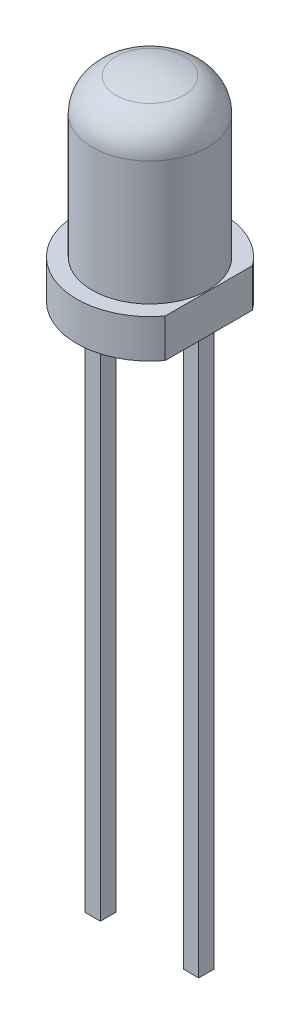
ISO-10303-21;
HEADER;
FILE_DESCRIPTION(('STEP AP214'),'2;1');
FILE_NAME('part.step','',(''),(''),'','','');
FILE_SCHEMA(('AUTOMOTIVE_DESIGN { 1 0 10303 214 1 1 1 1 }'));
ENDSEC;
DATA;
#1=APPLICATION_CONTEXT('core data for automotive mechanical design processes');
#2=APPLICATION_PROTOCOL_DEFINITION('international standard','automotive_design',2000,#1);
#3=PRODUCT_CONTEXT('',#1,'mechanical');
#4=PRODUCT('Part','Part','',(#3));
#5=PRODUCT_RELATED_PRODUCT_CATEGORY('part','',(#4));
#6=PRODUCT_DEFINITION_FORMATION('','',#4);
#7=PRODUCT_DEFINITION_CONTEXT('part definition',#1,'design');
#8=PRODUCT_DEFINITION('design','',#6,#7);
#9=PRODUCT_DEFINITION_SHAPE('','',#8);
#10=(LENGTH_UNIT() NAMED_UNIT(*) SI_UNIT(.MILLI.,.METRE.));
#11=(NAMED_UNIT(*) PLANE_ANGLE_UNIT() SI_UNIT($,.RADIAN.));
#12=(NAMED_UNIT(*) SI_UNIT($,.STERADIAN.) SOLID_ANGLE_UNIT());
#13=UNCERTAINTY_MEASURE_WITH_UNIT(LENGTH_MEASURE(1.E-05),#10,'distance_accuracy_value','');
#14=(GEOMETRIC_REPRESENTATION_CONTEXT(3) GLOBAL_UNCERTAINTY_ASSIGNED_CONTEXT((#13)) GLOBAL_UNIT_ASSIGNED_CONTEXT((#10,
#11,#12)) REPRESENTATION_CONTEXT('',''));
#15=CARTESIAN_POINT('',(0.,0.,0.));
#16=DIRECTION('',(0.,0.,1.));
#17=DIRECTION('',(1.,0.,0.));
#18=AXIS2_PLACEMENT_3D('',#15,#16,#17);
#19=CARTESIAN_POINT('',(0.,0.,0.2));
#20=DIRECTION('',(0.,0.,1.));
#21=DIRECTION('',(1.,0.,0.));
#22=AXIS2_PLACEMENT_3D('',#19,#20,#21);
#23=PLANE('',#22);
#24=DIRECTION('',(-1.,0.,0.));
#25=VECTOR('',#24,1.);
#26=CARTESIAN_POINT('',(1.062267709363,-14.925835152286,0.2));
#27=LINE('',#26,#25);
#28=CARTESIAN_POINT('',(1.462267709363,-14.925835152286,0.2));
#29=VERTEX_POINT('',#28);
#30=CARTESIAN_POINT('',(1.062267709363,-14.925835152286,0.2));
#31=VERTEX_POINT('',#30);
#32=EDGE_CURVE('E162',#29,#31,#27,.T.);
#33=ORIENTED_EDGE('',*,*,#32,.F.);
#34=DIRECTION('',(0.,1.,0.));
#35=VECTOR('',#34,1.);
#36=CARTESIAN_POINT('',(1.462267709363,-7.931203178759,0.2));
#37=LINE('',#36,#35);
#38=CARTESIAN_POINT('',(1.462267709363,-0.5635554078185,0.2));
#39=VERTEX_POINT('',#38);
#40=EDGE_CURVE('E392',#39,#29,#37,.F.);
#41=ORIENTED_EDGE('',*,*,#40,.F.);
#42=DIRECTION('',(1.,0.,0.));
#43=VECTOR('',#42,1.);
#44=CARTESIAN_POINT('',(0.,-0.5635554078185,0.2));
#45=LINE('',#44,#43);
#46=CARTESIAN_POINT('',(1.062267709363,-0.5635554078185,0.2));
#47=VERTEX_POINT('',#46);
#48=EDGE_CURVE('E102',#39,#47,#45,.F.);
#49=ORIENTED_EDGE('',*,*,#48,.T.);
#50=DIRECTION('',(0.,1.,0.));
#51=VECTOR('',#50,1.);
#52=CARTESIAN_POINT('',(1.062267709363,-0.2197633252505,0.2));
#53=LINE('',#52,#51);
#54=EDGE_CURVE('E108',#31,#47,#53,.T.);
#55=ORIENTED_EDGE('',*,*,#54,.F.);
#56=EDGE_LOOP('',(#33,#41,#49,#55));
#57=FACE_BOUND('',#56,.T.);
#58=ADVANCED_FACE('F40',(#57),#23,.T.);
#59=CARTESIAN_POINT('',(0.,0.,0.2));
#60=DIRECTION('',(0.,0.,1.));
#61=DIRECTION('',(1.,0.,0.));
#62=AXIS2_PLACEMENT_3D('',#59,#60,#61);
#63=PLANE('',#62);
#64=DIRECTION('',(0.,1.,0.));
#65=VECTOR('',#64,1.);
#66=CARTESIAN_POINT('',(-1.087586980766,-7.925835152286,0.2));
#67=LINE('',#66,#65);
#68=CARTESIAN_POINT('',(-1.087586980766,-0.5635554078185,0.2));
#69=VERTEX_POINT('',#68);
#70=CARTESIAN_POINT('',(-1.087586980766,-14.925835152286,0.2));
#71=VERTEX_POINT('',#70);
#72=EDGE_CURVE('E121',#69,#71,#67,.F.);
#73=ORIENTED_EDGE('',*,*,#72,.F.);
#74=DIRECTION('',(1.,0.,0.));
#75=VECTOR('',#74,1.);
#76=CARTESIAN_POINT('',(0.,-0.5635554078185,0.2));
#77=LINE('',#76,#75);
#78=CARTESIAN_POINT('',(-1.487586980766,-0.5635554078185,0.2));
#79=VERTEX_POINT('',#78);
#80=EDGE_CURVE('E397',#69,#79,#77,.F.);
#81=ORIENTED_EDGE('',*,*,#80,.T.);
#82=DIRECTION('',(0.,1.,0.));
#83=VECTOR('',#82,1.);
#84=CARTESIAN_POINT('',(-1.487586980766,-0.1419288954436,0.2));
#85=LINE('',#84,#83);
#86=CARTESIAN_POINT('',(-1.487586980766,-14.925835152286,0.2));
#87=VERTEX_POINT('',#86);
#88=EDGE_CURVE('E114',#87,#79,#85,.T.);
#89=ORIENTED_EDGE('',*,*,#88,.F.);
#90=DIRECTION('',(-1.,0.,0.));
#91=VECTOR('',#90,1.);
#92=CARTESIAN_POINT('',(-1.487586980766,-14.925835152286,0.2));
#93=LINE('',#92,#91);
#94=EDGE_CURVE('E175',#71,#87,#93,.T.);
#95=ORIENTED_EDGE('',*,*,#94,.F.);
#96=EDGE_LOOP('',(#73,#81,#89,#95));
#97=FACE_BOUND('',#96,.T.);
#98=ADVANCED_FACE('F220',(#97),#63,.T.);
#99=CARTESIAN_POINT('',(1.062267709363,-0.2197633252505,-0.2));
#100=DIRECTION('',(-1.,0.,0.));
#101=DIRECTION('',(0.,0.,1.));
#102=AXIS2_PLACEMENT_3D('',#99,#100,#101);
#103=PLANE('',#102);
#104=ORIENTED_EDGE('',*,*,#54,.T.);
#105=DIRECTION('',(0.,0.,1.));
#106=VECTOR('',#105,1.);
#107=CARTESIAN_POINT('',(1.062267709363,-0.5635554078185,-0.2));
#108=LINE('',#107,#106);
#109=CARTESIAN_POINT('',(1.062267709363,-0.5635554078185,-0.2));
#110=VERTEX_POINT('',#109);
#111=EDGE_CURVE('E145',#47,#110,#108,.F.);
#112=ORIENTED_EDGE('',*,*,#111,.T.);
#113=DIRECTION('',(0.,1.,0.));
#114=VECTOR('',#113,1.);
#115=CARTESIAN_POINT('',(1.062267709363,0.,-0.2));
#116=LINE('',#115,#114);
#117=CARTESIAN_POINT('',(1.062267709363,-14.925835152286,-0.2));
#118=VERTEX_POINT('',#117);
#119=EDGE_CURVE('E140',#110,#118,#116,.F.);
#120=ORIENTED_EDGE('',*,*,#119,.T.);
#121=DIRECTION('',(0.,0.,-1.));
#122=VECTOR('',#121,1.);
#123=CARTESIAN_POINT('',(1.062267709363,-14.925835152286,0.2));
#124=LINE('',#123,#122);
#125=EDGE_CURVE('E144',#31,#118,#124,.T.);
#126=ORIENTED_EDGE('',*,*,#125,.F.);
#127=EDGE_LOOP('',(#104,#112,#120,#126));
#128=FACE_BOUND('',#127,.T.);
#129=ADVANCED_FACE('F142',(#128),#103,.T.);
#130=CARTESIAN_POINT('',(1.462267709363,-7.931203178759,-0.2));
#131=DIRECTION('',(1.,0.,0.));
#132=DIRECTION('',(0.,0.,-1.));
#133=AXIS2_PLACEMENT_3D('',#130,#131,#132);
#134=PLANE('',#133);
#135=DIRECTION('',(0.,1.,0.));
#136=VECTOR('',#135,1.);
#137=CARTESIAN_POINT('',(1.462267709363,0.,-0.2));
#138=LINE('',#137,#136);
#139=CARTESIAN_POINT('',(1.462267709363,-14.925835152286,-0.2));
#140=VERTEX_POINT('',#139);
#141=CARTESIAN_POINT('',(1.462267709363,-0.5635554078185,-0.2));
#142=VERTEX_POINT('',#141);
#143=EDGE_CURVE('E149',#140,#142,#138,.T.);
#144=ORIENTED_EDGE('',*,*,#143,.T.);
#145=DIRECTION('',(0.,0.,-1.));
#146=VECTOR('',#145,1.);
#147=CARTESIAN_POINT('',(1.462267709363,-0.5635554078185,-0.2));
#148=LINE('',#147,#146);
#149=EDGE_CURVE('E388',#142,#39,#148,.F.);
#150=ORIENTED_EDGE('',*,*,#149,.T.);
#151=ORIENTED_EDGE('',*,*,#40,.T.);
#152=DIRECTION('',(0.,0.,1.));
#153=VECTOR('',#152,1.);
#154=CARTESIAN_POINT('',(1.462267709363,-14.925835152286,0.2));
#155=LINE('',#154,#153);
#156=EDGE_CURVE('E157',#140,#29,#155,.T.);
#157=ORIENTED_EDGE('',*,*,#156,.F.);
#158=EDGE_LOOP('',(#144,#150,#151,#157));
#159=FACE_BOUND('',#158,.T.);
#160=ADVANCED_FACE('F213',(#159),#134,.T.);
#161=CARTESIAN_POINT('',(-1.487586980766,-0.1419288954436,-0.2));
#162=DIRECTION('',(-1.,0.,0.));
#163=DIRECTION('',(0.,0.,1.));
#164=AXIS2_PLACEMENT_3D('',#161,#162,#163);
#165=PLANE('',#164);
#166=ORIENTED_EDGE('',*,*,#88,.T.);
#167=DIRECTION('',(0.,0.,1.));
#168=VECTOR('',#167,1.);
#169=CARTESIAN_POINT('',(-1.487586980766,-0.5635554078185,-0.2));
#170=LINE('',#169,#168);
#171=CARTESIAN_POINT('',(-1.487586980766,-0.5635554078185,-0.2));
#172=VERTEX_POINT('',#171);
#173=EDGE_CURVE('E387',#79,#172,#170,.F.);
#174=ORIENTED_EDGE('',*,*,#173,.T.);
#175=DIRECTION('',(0.,1.,0.));
#176=VECTOR('',#175,1.);
#177=CARTESIAN_POINT('',(-1.487586980766,0.,-0.2));
#178=LINE('',#177,#176);
#179=CARTESIAN_POINT('',(-1.487586980766,-14.925835152286,-0.2));
#180=VERTEX_POINT('',#179);
#181=EDGE_CURVE('E377',#172,#180,#178,.F.);
#182=ORIENTED_EDGE('',*,*,#181,.T.);
#183=DIRECTION('',(0.,0.,-1.));
#184=VECTOR('',#183,1.);
#185=CARTESIAN_POINT('',(-1.487586980766,-14.925835152286,0.2));
#186=LINE('',#185,#184);
#187=EDGE_CURVE('E167',#87,#180,#186,.T.);
#188=ORIENTED_EDGE('',*,*,#187,.F.);
#189=EDGE_LOOP('',(#166,#174,#182,#188));
#190=FACE_BOUND('',#189,.T.);
#191=ADVANCED_FACE('F210',(#190),#165,.T.);
#192=CARTESIAN_POINT('',(-1.087586980766,-7.925835152286,-0.2));
#193=DIRECTION('',(1.,0.,0.));
#194=DIRECTION('',(0.,0.,-1.));
#195=AXIS2_PLACEMENT_3D('',#192,#193,#194);
#196=PLANE('',#195);
#197=DIRECTION('',(0.,1.,0.));
#198=VECTOR('',#197,1.);
#199=CARTESIAN_POINT('',(-1.087586980766,0.,-0.2));
#200=LINE('',#199,#198);
#201=CARTESIAN_POINT('',(-1.087586980766,-14.925835152286,-0.2));
#202=VERTEX_POINT('',#201);
#203=CARTESIAN_POINT('',(-1.087586980766,-0.5635554078185,-0.2));
#204=VERTEX_POINT('',#203);
#205=EDGE_CURVE('E374',#202,#204,#200,.T.);
#206=ORIENTED_EDGE('',*,*,#205,.T.);
#207=DIRECTION('',(0.,0.,-1.));
#208=VECTOR('',#207,1.);
#209=CARTESIAN_POINT('',(-1.087586980766,-0.5635554078185,-0.2));
#210=LINE('',#209,#208);
#211=EDGE_CURVE('E78',#204,#69,#210,.F.);
#212=ORIENTED_EDGE('',*,*,#211,.T.);
#213=ORIENTED_EDGE('',*,*,#72,.T.);
#214=DIRECTION('',(0.,0.,1.));
#215=VECTOR('',#214,1.);
#216=CARTESIAN_POINT('',(-1.087586980766,-14.925835152286,0.2));
#217=LINE('',#216,#215);
#218=EDGE_CURVE('E173',#202,#71,#217,.T.);
#219=ORIENTED_EDGE('',*,*,#218,.F.);
#220=EDGE_LOOP('',(#206,#212,#213,#219));
#221=FACE_BOUND('',#220,.T.);
#222=ADVANCED_FACE('F207',(#221),#196,.T.);
#223=CARTESIAN_POINT('',(0.,0.,-0.2));
#224=DIRECTION('',(0.,0.,1.));
#225=DIRECTION('',(1.,0.,0.));
#226=AXIS2_PLACEMENT_3D('',#223,#224,#225);
#227=PLANE('',#226);
#228=DIRECTION('',(1.,0.,0.));
#229=VECTOR('',#228,1.);
#230=CARTESIAN_POINT('',(1.062267709363,-14.925835152286,-0.2));
#231=LINE('',#230,#229);
#232=EDGE_CURVE('E152',#118,#140,#231,.T.);
#233=ORIENTED_EDGE('',*,*,#232,.F.);
#234=ORIENTED_EDGE('',*,*,#119,.F.);
#235=DIRECTION('',(1.,0.,0.));
#236=VECTOR('',#235,1.);
#237=CARTESIAN_POINT('',(0.,-0.5635554078185,-0.2));
#238=LINE('',#237,#236);
#239=EDGE_CURVE('E372',#142,#110,#238,.F.);
#240=ORIENTED_EDGE('',*,*,#239,.F.);
#241=ORIENTED_EDGE('',*,*,#143,.F.);
#242=EDGE_LOOP('',(#233,#234,#240,#241));
#243=FACE_BOUND('',#242,.T.);
#244=ADVANCED_FACE('F153',(#243),#227,.F.);
#245=CARTESIAN_POINT('',(0.,0.,-0.2));
#246=DIRECTION('',(0.,0.,1.));
#247=DIRECTION('',(1.,0.,0.));
#248=AXIS2_PLACEMENT_3D('',#245,#246,#247);
#249=PLANE('',#248);
#250=ORIENTED_EDGE('',*,*,#205,.F.);
#251=DIRECTION('',(1.,0.,0.));
#252=VECTOR('',#251,1.);
#253=CARTESIAN_POINT('',(-1.487586980766,-14.925835152286,-0.2));
#254=LINE('',#253,#252);
#255=EDGE_CURVE('E170',#180,#202,#254,.T.);
#256=ORIENTED_EDGE('',*,*,#255,.F.);
#257=ORIENTED_EDGE('',*,*,#181,.F.);
#258=DIRECTION('',(1.,0.,0.));
#259=VECTOR('',#258,1.);
#260=CARTESIAN_POINT('',(0.,-0.5635554078185,-0.2));
#261=LINE('',#260,#259);
#262=EDGE_CURVE('E370',#204,#172,#261,.F.);
#263=ORIENTED_EDGE('',*,*,#262,.F.);
#264=EDGE_LOOP('',(#250,#256,#257,#263));
#265=FACE_BOUND('',#264,.T.);
#266=ADVANCED_FACE('F201',(#265),#249,.F.);
#267=CARTESIAN_POINT('',(0.,-0.5635554078185,0.));
#268=DIRECTION('',(0.,-1.,0.));
#269=DIRECTION('',(0.,0.,-1.));
#270=AXIS2_PLACEMENT_3D('',#267,#268,#269);
#271=PLANE('',#270);
#272=ORIENTED_EDGE('',*,*,#211,.F.);
#273=ORIENTED_EDGE('',*,*,#262,.T.);
#274=ORIENTED_EDGE('',*,*,#173,.F.);
#275=ORIENTED_EDGE('',*,*,#80,.F.);
#276=EDGE_LOOP('',(#272,#273,#274,#275));
#277=FACE_BOUND('',#276,.T.);
#278=ORIENTED_EDGE('',*,*,#149,.F.);
#279=ORIENTED_EDGE('',*,*,#239,.T.);
#280=ORIENTED_EDGE('',*,*,#111,.F.);
#281=ORIENTED_EDGE('',*,*,#48,.F.);
#282=EDGE_LOOP('',(#278,#279,#280,#281));
#283=FACE_BOUND('',#282,.T.);
#284=CARTESIAN_POINT('',(0.,-0.5635554078185,0.));
#285=DIRECTION('',(0.,-1.,0.));
#286=DIRECTION('',(0.,0.,-1.));
#287=AXIS2_PLACEMENT_3D('',#284,#285,#286);
#288=CIRCLE('',#287,1.9);
#289=CARTESIAN_POINT('',(1.52589293738703,-0.5635554078185,-1.13210014735109));
#290=VERTEX_POINT('',#289);
#291=CARTESIAN_POINT('',(1.52589293738703,-0.5635554078185,1.13210014735109));
#292=VERTEX_POINT('',#291);
#293=EDGE_CURVE('E44',#290,#292,#288,.F.);
#294=ORIENTED_EDGE('',*,*,#293,.F.);
#295=DIRECTION('',(0.,0.,1.));
#296=VECTOR('',#295,1.);
#297=CARTESIAN_POINT('',(1.525892937387,-0.5635554078185,2.175705867646));
#298=LINE('',#297,#296);
#299=EDGE_CURVE('E69',#290,#292,#298,.T.);
#300=ORIENTED_EDGE('',*,*,#299,.T.);
#301=EDGE_LOOP('',(#294,#300));
#302=FACE_BOUND('',#301,.T.);
#303=ADVANCED_FACE('F198',(#277,#283,#302),#271,.T.);
#304=CARTESIAN_POINT('',(1.525892937387,-0.5635554078185,2.175705867646));
#305=DIRECTION('',(-1.,0.,0.));
#306=DIRECTION('',(0.,0.,1.));
#307=AXIS2_PLACEMENT_3D('',#304,#305,#306);
#308=PLANE('',#307);
#309=ORIENTED_EDGE('',*,*,#299,.F.);
#310=DIRECTION('',(0.,-1.,0.));
#311=VECTOR('',#310,1.);
#312=CARTESIAN_POINT('',(1.52589293738707,0.,-1.13210014735105));
#313=LINE('',#312,#311);
#314=CARTESIAN_POINT('',(1.52589293738703,0.4364445921815,-1.13210014735109));
#315=VERTEX_POINT('',#314);
#316=EDGE_CURVE('E369',#315,#290,#313,.T.);
#317=ORIENTED_EDGE('',*,*,#316,.F.);
#318=DIRECTION('',(0.,0.,-1.));
#319=VECTOR('',#318,1.);
#320=CARTESIAN_POINT('',(1.525892937387,0.4364445921815,0.));
#321=LINE('',#320,#319);
#322=CARTESIAN_POINT('',(1.52589293738703,0.4364445921815,1.13210014735109));
#323=VERTEX_POINT('',#322);
#324=EDGE_CURVE('E59',#315,#323,#321,.F.);
#325=ORIENTED_EDGE('',*,*,#324,.T.);
#326=DIRECTION('',(0.,-1.,0.));
#327=VECTOR('',#326,1.);
#328=CARTESIAN_POINT('',(1.52589293738707,0.,1.13210014735105));
#329=LINE('',#328,#327);
#330=EDGE_CURVE('E179',#292,#323,#329,.F.);
#331=ORIENTED_EDGE('',*,*,#330,.F.);
#332=EDGE_LOOP('',(#309,#317,#325,#331));
#333=FACE_BOUND('',#332,.T.);
#334=ADVANCED_FACE('F194',(#333),#308,.F.);
#335=CARTESIAN_POINT('',(0.,0.,0.));
#336=DIRECTION('',(0.,-1.,0.));
#337=DIRECTION('',(0.,0.,-1.));
#338=AXIS2_PLACEMENT_3D('',#335,#336,#337);
#339=CYLINDRICAL_SURFACE('',#338,1.9);
#340=ORIENTED_EDGE('',*,*,#330,.T.);
#341=CARTESIAN_POINT('',(0.,0.4364445921815,0.));
#342=DIRECTION('',(0.,-1.,0.));
#343=DIRECTION('',(0.,0.,-1.));
#344=AXIS2_PLACEMENT_3D('',#341,#342,#343);
#345=CIRCLE('',#344,1.9);
#346=EDGE_CURVE('E178',#323,#315,#345,.T.);
#347=ORIENTED_EDGE('',*,*,#346,.T.);
#348=ORIENTED_EDGE('',*,*,#316,.T.);
#349=ORIENTED_EDGE('',*,*,#293,.T.);
#350=EDGE_LOOP('',(#340,#347,#348,#349));
#351=FACE_BOUND('',#350,.T.);
#352=ADVANCED_FACE('F189',(#351),#339,.T.);
#353=CARTESIAN_POINT('',(0.,1.760466051686,0.));
#354=DIRECTION('',(-1.,0.,0.));
#355=DIRECTION('',(0.,0.,-1.));
#356=AXIS2_PLACEMENT_3D('',#353,#354,#355);
#357=SPHERICAL_SURFACE('',#356,2.875978540496);
#358=CARTESIAN_POINT('',(0.,4.49946832337521,0.));
#359=DIRECTION('',(0.,-1.,0.));
#360=DIRECTION('',(0.,0.,-1.));
#361=AXIS2_PLACEMENT_3D('',#358,#359,#360);
#362=CIRCLE('',#361,0.876994367751447);
#363=CARTESIAN_POINT('',(0.,4.49946832337521,-0.876994367751445));
#364=VERTEX_POINT('',#363);
#365=EDGE_CURVE('E349',#364,#364,#362,.T.);
#366=ORIENTED_EDGE('',*,*,#365,.F.);
#367=EDGE_LOOP('',(#366));
#368=FACE_BOUND('',#367,.T.);
#369=ADVANCED_FACE('F184',(#368),#357,.T.);
#370=CARTESIAN_POINT('',(0.,0.4364445921815,0.));
#371=DIRECTION('',(0.,-1.,0.));
#372=DIRECTION('',(0.,0.,-1.));
#373=AXIS2_PLACEMENT_3D('',#370,#371,#372);
#374=PLANE('',#373);
#375=CARTESIAN_POINT('',(0.,0.4364445921815,0.));
#376=DIRECTION('',(0.,-1.,0.));
#377=DIRECTION('',(0.,0.,-1.));
#378=AXIS2_PLACEMENT_3D('',#375,#376,#377);
#379=CIRCLE('',#378,1.5);
#380=CARTESIAN_POINT('',(0.,0.4364445921815,-1.5));
#381=VERTEX_POINT('',#380);
#382=EDGE_CURVE('E50',#381,#381,#379,.F.);
#383=ORIENTED_EDGE('',*,*,#382,.F.);
#384=EDGE_LOOP('',(#383));
#385=FACE_BOUND('',#384,.T.);
#386=ORIENTED_EDGE('',*,*,#324,.F.);
#387=ORIENTED_EDGE('',*,*,#346,.F.);
#388=EDGE_LOOP('',(#386,#387));
#389=FACE_BOUND('',#388,.T.);
#390=ADVANCED_FACE('F188',(#385,#389),#374,.F.);
#391=CARTESIAN_POINT('',(0.,3.64582782673242,0.));
#392=DIRECTION('',(0.,-1.,0.));
#393=DIRECTION('',(0.,0.,-1.));
#394=AXIS2_PLACEMENT_3D('',#391,#392,#393);
#395=DEGENERATE_TOROIDAL_SURFACE('',#394,0.603669326960365,0.896330673039812,.T.);
#396=ORIENTED_EDGE('',*,*,#365,.T.);
#397=EDGE_LOOP('',(#396));
#398=FACE_BOUND('',#397,.T.);
#399=CARTESIAN_POINT('',(0.,3.645827826732,0.));
#400=DIRECTION('',(0.,-1.,0.));
#401=DIRECTION('',(0.,0.,-1.));
#402=AXIS2_PLACEMENT_3D('',#399,#400,#401);
#403=CIRCLE('',#402,1.5);
#404=CARTESIAN_POINT('',(0.,3.645827826732,-1.5));
#405=VERTEX_POINT('',#404);
#406=EDGE_CURVE('E12',#405,#405,#403,.T.);
#407=ORIENTED_EDGE('',*,*,#406,.F.);
#408=EDGE_LOOP('',(#407));
#409=FACE_BOUND('',#408,.T.);
#410=ADVANCED_FACE('F42',(#398,#409),#395,.T.);
#411=CARTESIAN_POINT('',(0.,0.,0.));
#412=DIRECTION('',(0.,-1.,0.));
#413=DIRECTION('',(0.,0.,-1.));
#414=AXIS2_PLACEMENT_3D('',#411,#412,#413);
#415=CYLINDRICAL_SURFACE('',#414,1.5);
#416=ORIENTED_EDGE('',*,*,#406,.T.);
#417=EDGE_LOOP('',(#416));
#418=FACE_BOUND('',#417,.T.);
#419=ORIENTED_EDGE('',*,*,#382,.T.);
#420=EDGE_LOOP('',(#419));
#421=FACE_BOUND('',#420,.T.);
#422=ADVANCED_FACE('F229',(#418,#421),#415,.T.);
#423=CARTESIAN_POINT('',(0.,-14.925835152286,0.));
#424=DIRECTION('',(0.,-1.,0.));
#425=DIRECTION('',(0.,0.,-1.));
#426=AXIS2_PLACEMENT_3D('',#423,#424,#425);
#427=PLANE('',#426);
#428=ORIENTED_EDGE('',*,*,#187,.T.);
#429=ORIENTED_EDGE('',*,*,#255,.T.);
#430=ORIENTED_EDGE('',*,*,#218,.T.);
#431=ORIENTED_EDGE('',*,*,#94,.T.);
#432=EDGE_LOOP('',(#428,#429,#430,#431));
#433=FACE_BOUND('',#432,.T.);
#434=ADVANCED_FACE('F224',(#433),#427,.T.);
#435=CARTESIAN_POINT('',(0.,-14.925835152286,0.));
#436=DIRECTION('',(0.,-1.,0.));
#437=DIRECTION('',(0.,0.,-1.));
#438=AXIS2_PLACEMENT_3D('',#435,#436,#437);
#439=PLANE('',#438);
#440=ORIENTED_EDGE('',*,*,#125,.T.);
#441=ORIENTED_EDGE('',*,*,#232,.T.);
#442=ORIENTED_EDGE('',*,*,#156,.T.);
#443=ORIENTED_EDGE('',*,*,#32,.T.);
#444=EDGE_LOOP('',(#440,#441,#442,#443));
#445=FACE_BOUND('',#444,.T.);
#446=ADVANCED_FACE('F160',(#445),#439,.T.);
#447=CLOSED_SHELL('',(#58,#98,#129,#160,#191,#222,#244,#266,#303,#334,#352,#369,#390,#410,#422,
#434,#446));
#448=MANIFOLD_SOLID_BREP('B2',#447);
#449=ADVANCED_BREP_SHAPE_REPRESENTATION('',(#18,#448),#14);
#450=SHAPE_DEFINITION_REPRESENTATION(#9,#449);
ENDSEC;
END-ISO-10303-21;
